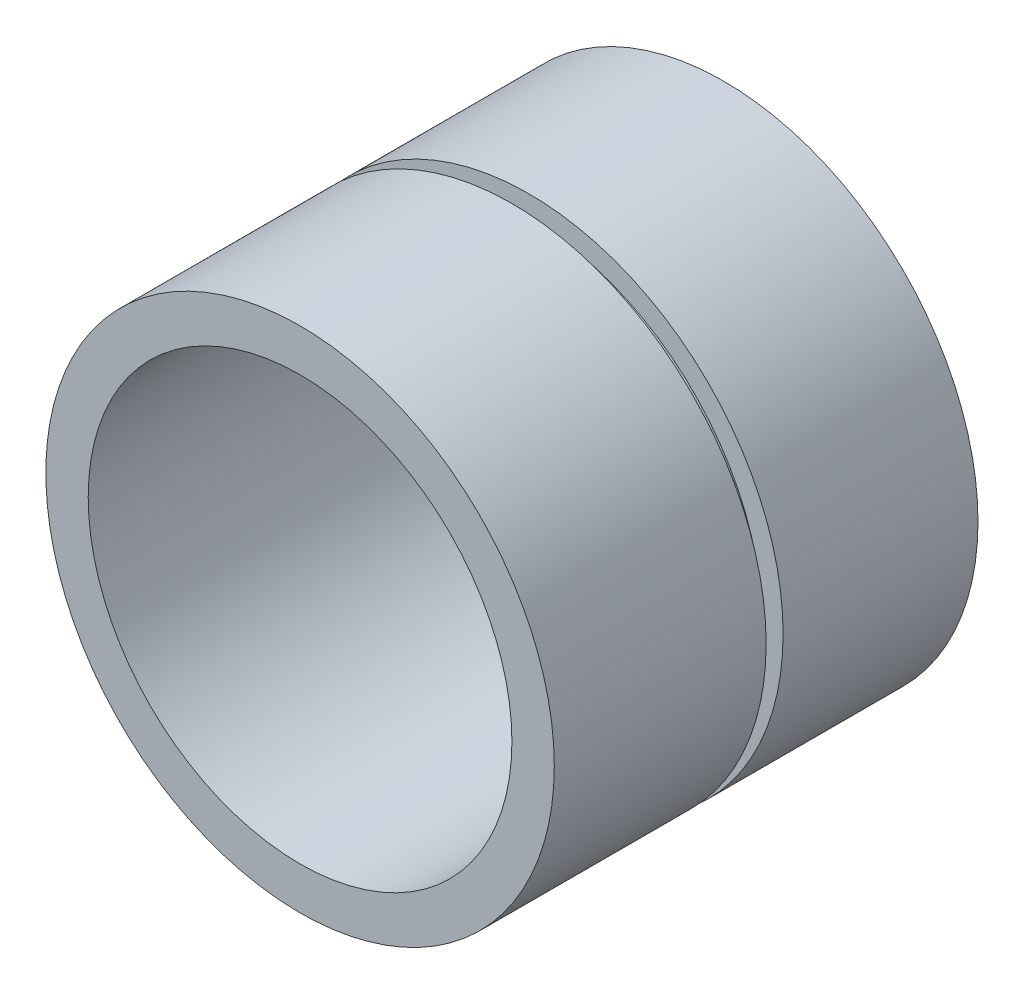
ISO-10303-21;
HEADER;
FILE_DESCRIPTION(('STEP AP214'),'2;1');
FILE_NAME('part.step','',(''),(''),'','','');
FILE_SCHEMA(('AUTOMOTIVE_DESIGN { 1 0 10303 214 1 1 1 1 }'));
ENDSEC;
DATA;
#1=APPLICATION_CONTEXT('core data for automotive mechanical design processes');
#2=APPLICATION_PROTOCOL_DEFINITION('international standard','automotive_design',2000,#1);
#3=PRODUCT_CONTEXT('',#1,'mechanical');
#4=PRODUCT('Part','Part','',(#3));
#5=PRODUCT_RELATED_PRODUCT_CATEGORY('part','',(#4));
#6=PRODUCT_DEFINITION_FORMATION('','',#4);
#7=PRODUCT_DEFINITION_CONTEXT('part definition',#1,'design');
#8=PRODUCT_DEFINITION('design','',#6,#7);
#9=PRODUCT_DEFINITION_SHAPE('','',#8);
#10=(LENGTH_UNIT() NAMED_UNIT(*) SI_UNIT(.MILLI.,.METRE.));
#11=(NAMED_UNIT(*) PLANE_ANGLE_UNIT() SI_UNIT($,.RADIAN.));
#12=(NAMED_UNIT(*) SI_UNIT($,.STERADIAN.) SOLID_ANGLE_UNIT());
#13=UNCERTAINTY_MEASURE_WITH_UNIT(LENGTH_MEASURE(1.E-05),#10,'distance_accuracy_value','');
#14=(GEOMETRIC_REPRESENTATION_CONTEXT(3) GLOBAL_UNCERTAINTY_ASSIGNED_CONTEXT((#13)) GLOBAL_UNIT_ASSIGNED_CONTEXT((#10,
#11,#12)) REPRESENTATION_CONTEXT('',''));
#15=CARTESIAN_POINT('',(0.,0.,0.));
#16=DIRECTION('',(0.,0.,1.));
#17=DIRECTION('',(1.,0.,0.));
#18=AXIS2_PLACEMENT_3D('',#15,#16,#17);
#19=CARTESIAN_POINT('',(0.,0.,5.));
#20=DIRECTION('',(0.,0.,-1.));
#21=DIRECTION('',(-1.,0.,0.));
#22=AXIS2_PLACEMENT_3D('',#19,#20,#21);
#23=CYLINDRICAL_SURFACE('',#22,3.);
#24=CARTESIAN_POINT('',(0.,0.,0.));
#25=DIRECTION('',(0.,0.,1.));
#26=DIRECTION('',(1.,0.,0.));
#27=AXIS2_PLACEMENT_3D('',#24,#25,#26);
#28=CIRCLE('',#27,3.);
#29=CARTESIAN_POINT('',(3.,0.,0.));
#30=VERTEX_POINT('',#29);
#31=EDGE_CURVE('E54',#30,#30,#28,.T.);
#32=ORIENTED_EDGE('',*,*,#31,.T.);
#33=EDGE_LOOP('',(#32));
#34=FACE_BOUND('',#33,.T.);
#35=CARTESIAN_POINT('',(0.,0.,2.3));
#36=DIRECTION('',(0.,0.,1.));
#37=DIRECTION('',(1.,0.,0.));
#38=AXIS2_PLACEMENT_3D('',#35,#36,#37);
#39=CIRCLE('',#38,3.);
#40=CARTESIAN_POINT('',(3.,0.,2.3));
#41=VERTEX_POINT('',#40);
#42=EDGE_CURVE('E69',#41,#41,#39,.T.);
#43=ORIENTED_EDGE('',*,*,#42,.F.);
#44=EDGE_LOOP('',(#43));
#45=FACE_BOUND('',#44,.T.);
#46=ADVANCED_FACE('F50',(#34,#45),#23,.T.);
#47=CARTESIAN_POINT('',(0.,0.,0.));
#48=DIRECTION('',(0.,0.,1.));
#49=DIRECTION('',(1.,0.,0.));
#50=AXIS2_PLACEMENT_3D('',#47,#48,#49);
#51=PLANE('',#50);
#52=CARTESIAN_POINT('',(0.,0.,0.));
#53=DIRECTION('',(0.,0.,-1.));
#54=DIRECTION('',(-1.,0.,0.));
#55=AXIS2_PLACEMENT_3D('',#52,#53,#54);
#56=CIRCLE('',#55,2.5);
#57=CARTESIAN_POINT('',(-2.5,0.,0.));
#58=VERTEX_POINT('',#57);
#59=EDGE_CURVE('E65',#58,#58,#56,.T.);
#60=ORIENTED_EDGE('',*,*,#59,.F.);
#61=EDGE_LOOP('',(#60));
#62=FACE_BOUND('',#61,.T.);
#63=ORIENTED_EDGE('',*,*,#31,.F.);
#64=EDGE_LOOP('',(#63));
#65=FACE_BOUND('',#64,.T.);
#66=ADVANCED_FACE('F101',(#62,#65),#51,.F.);
#67=CARTESIAN_POINT('',(0.,0.,2.5));
#68=DIRECTION('',(0.,0.,1.));
#69=DIRECTION('',(1.,0.,0.));
#70=AXIS2_PLACEMENT_3D('',#67,#68,#69);
#71=CIRCLE('',#70,3.);
#72=CARTESIAN_POINT('',(3.,0.,2.5));
#73=VERTEX_POINT('',#72);
#74=EDGE_CURVE('E73',#73,#73,#71,.T.);
#75=ORIENTED_EDGE('',*,*,#74,.T.);
#76=EDGE_LOOP('',(#75));
#77=FACE_BOUND('',#76,.T.);
#78=CARTESIAN_POINT('',(0.,0.,5.));
#79=DIRECTION('',(0.,0.,1.));
#80=DIRECTION('',(1.,0.,0.));
#81=AXIS2_PLACEMENT_3D('',#78,#79,#80);
#82=CIRCLE('',#81,3.);
#83=CARTESIAN_POINT('',(3.,0.,5.));
#84=VERTEX_POINT('',#83);
#85=EDGE_CURVE('E11',#84,#84,#82,.T.);
#86=ORIENTED_EDGE('',*,*,#85,.F.);
#87=EDGE_LOOP('',(#86));
#88=FACE_BOUND('',#87,.T.);
#89=ADVANCED_FACE('F52',(#77,#88),#23,.T.);
#90=CARTESIAN_POINT('',(0.,0.,5.));
#91=DIRECTION('',(0.,0.,1.));
#92=DIRECTION('',(1.,0.,0.));
#93=AXIS2_PLACEMENT_3D('',#90,#91,#92);
#94=PLANE('',#93);
#95=CARTESIAN_POINT('',(0.,0.,5.));
#96=DIRECTION('',(0.,0.,-1.));
#97=DIRECTION('',(-1.,0.,0.));
#98=AXIS2_PLACEMENT_3D('',#95,#96,#97);
#99=CIRCLE('',#98,2.5);
#100=CARTESIAN_POINT('',(-2.5,0.,5.));
#101=VERTEX_POINT('',#100);
#102=EDGE_CURVE('E63',#101,#101,#99,.T.);
#103=ORIENTED_EDGE('',*,*,#102,.T.);
#104=EDGE_LOOP('',(#103));
#105=FACE_BOUND('',#104,.T.);
#106=ORIENTED_EDGE('',*,*,#85,.T.);
#107=EDGE_LOOP('',(#106));
#108=FACE_BOUND('',#107,.T.);
#109=ADVANCED_FACE('F109',(#105,#108),#94,.T.);
#110=CARTESIAN_POINT('',(0.,0.,5.));
#111=DIRECTION('',(0.,0.,-1.));
#112=DIRECTION('',(-1.,0.,0.));
#113=AXIS2_PLACEMENT_3D('',#110,#111,#112);
#114=CYLINDRICAL_SURFACE('',#113,2.5);
#115=ORIENTED_EDGE('',*,*,#102,.F.);
#116=EDGE_LOOP('',(#115));
#117=FACE_BOUND('',#116,.T.);
#118=ORIENTED_EDGE('',*,*,#59,.T.);
#119=EDGE_LOOP('',(#118));
#120=FACE_BOUND('',#119,.T.);
#121=ADVANCED_FACE('F96',(#117,#120),#114,.F.);
#122=CARTESIAN_POINT('',(0.,0.,2.3));
#123=DIRECTION('',(0.,0.,1.));
#124=DIRECTION('',(1.,0.,0.));
#125=AXIS2_PLACEMENT_3D('',#122,#123,#124);
#126=PLANE('',#125);
#127=CARTESIAN_POINT('',(0.,0.,2.3));
#128=DIRECTION('',(0.,0.,1.));
#129=DIRECTION('',(1.,0.,0.));
#130=AXIS2_PLACEMENT_3D('',#127,#128,#129);
#131=CIRCLE('',#130,2.75);
#132=CARTESIAN_POINT('',(2.75,0.,2.3));
#133=VERTEX_POINT('',#132);
#134=EDGE_CURVE('E77',#133,#133,#131,.T.);
#135=ORIENTED_EDGE('',*,*,#134,.F.);
#136=EDGE_LOOP('',(#135));
#137=FACE_BOUND('',#136,.T.);
#138=ORIENTED_EDGE('',*,*,#42,.T.);
#139=EDGE_LOOP('',(#138));
#140=FACE_BOUND('',#139,.T.);
#141=ADVANCED_FACE('F92',(#137,#140),#126,.T.);
#142=CARTESIAN_POINT('',(0.,0.,2.5));
#143=DIRECTION('',(0.,0.,1.));
#144=DIRECTION('',(1.,0.,0.));
#145=AXIS2_PLACEMENT_3D('',#142,#143,#144);
#146=PLANE('',#145);
#147=CARTESIAN_POINT('',(0.,0.,2.5));
#148=DIRECTION('',(0.,0.,1.));
#149=DIRECTION('',(1.,0.,0.));
#150=AXIS2_PLACEMENT_3D('',#147,#148,#149);
#151=CIRCLE('',#150,2.75);
#152=CARTESIAN_POINT('',(2.75,0.,2.5));
#153=VERTEX_POINT('',#152);
#154=EDGE_CURVE('E81',#153,#153,#151,.T.);
#155=ORIENTED_EDGE('',*,*,#154,.T.);
#156=EDGE_LOOP('',(#155));
#157=FACE_BOUND('',#156,.T.);
#158=ORIENTED_EDGE('',*,*,#74,.F.);
#159=EDGE_LOOP('',(#158));
#160=FACE_BOUND('',#159,.T.);
#161=ADVANCED_FACE('F95',(#157,#160),#146,.F.);
#162=CARTESIAN_POINT('',(0.,0.,2.3));
#163=DIRECTION('',(0.,0.,1.));
#164=DIRECTION('',(1.,0.,0.));
#165=AXIS2_PLACEMENT_3D('',#162,#163,#164);
#166=CYLINDRICAL_SURFACE('',#165,2.75);
#167=ORIENTED_EDGE('',*,*,#134,.T.);
#168=EDGE_LOOP('',(#167));
#169=FACE_BOUND('',#168,.T.);
#170=ORIENTED_EDGE('',*,*,#154,.F.);
#171=EDGE_LOOP('',(#170));
#172=FACE_BOUND('',#171,.T.);
#173=ADVANCED_FACE('F89',(#169,#172),#166,.T.);
#174=CLOSED_SHELL('',(#46,#66,#89,#109,#121,#141,#161,#173));
#175=MANIFOLD_SOLID_BREP('B2',#174);
#176=ADVANCED_BREP_SHAPE_REPRESENTATION('',(#18,#175),#14);
#177=SHAPE_DEFINITION_REPRESENTATION(#9,#176);
ENDSEC;
END-ISO-10303-21;
